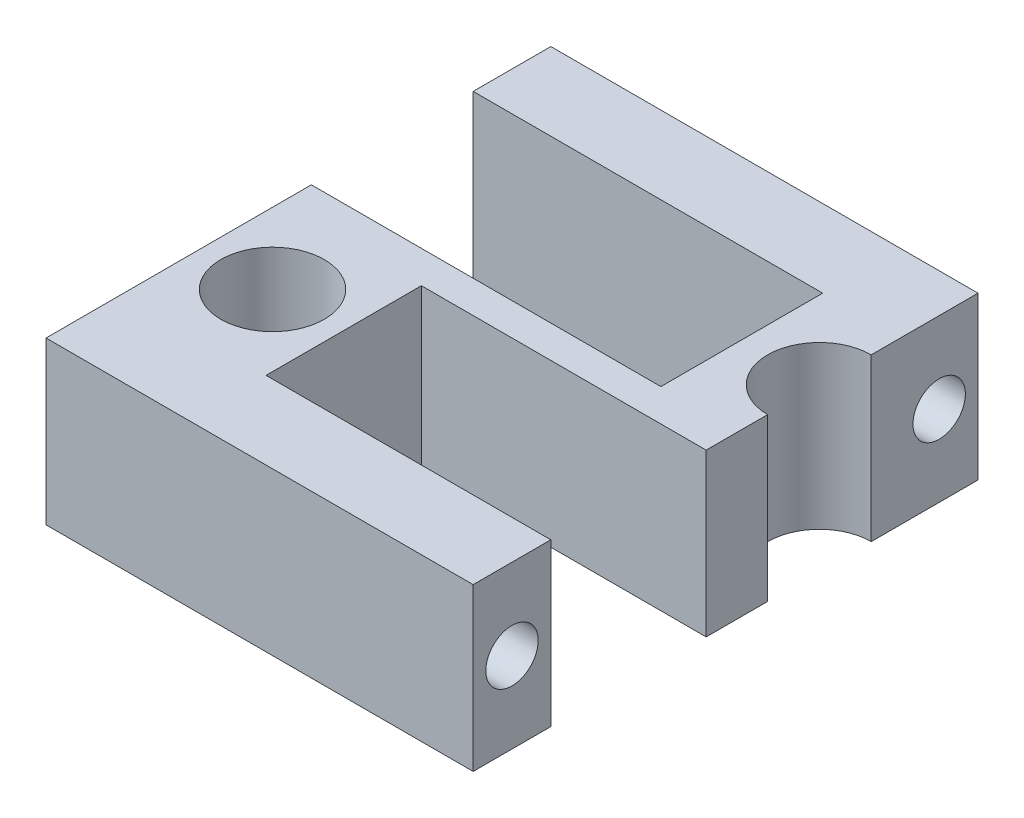
ISO-10303-21;
HEADER;
FILE_DESCRIPTION(('STEP AP214'),'2;1');
FILE_NAME('part.step','',(''),(''),'','','');
FILE_SCHEMA(('AUTOMOTIVE_DESIGN { 1 0 10303 214 1 1 1 1 }'));
ENDSEC;
DATA;
#1=APPLICATION_CONTEXT('core data for automotive mechanical design processes');
#2=APPLICATION_PROTOCOL_DEFINITION('international standard','automotive_design',2000,#1);
#3=PRODUCT_CONTEXT('',#1,'mechanical');
#4=PRODUCT('Part','Part','',(#3));
#5=PRODUCT_RELATED_PRODUCT_CATEGORY('part','',(#4));
#6=PRODUCT_DEFINITION_FORMATION('','',#4);
#7=PRODUCT_DEFINITION_CONTEXT('part definition',#1,'design');
#8=PRODUCT_DEFINITION('design','',#6,#7);
#9=PRODUCT_DEFINITION_SHAPE('','',#8);
#10=(LENGTH_UNIT() NAMED_UNIT(*) SI_UNIT(.MILLI.,.METRE.));
#11=(NAMED_UNIT(*) PLANE_ANGLE_UNIT() SI_UNIT($,.RADIAN.));
#12=(NAMED_UNIT(*) SI_UNIT($,.STERADIAN.) SOLID_ANGLE_UNIT());
#13=UNCERTAINTY_MEASURE_WITH_UNIT(LENGTH_MEASURE(1.E-05),#10,'distance_accuracy_value','');
#14=(GEOMETRIC_REPRESENTATION_CONTEXT(3) GLOBAL_UNCERTAINTY_ASSIGNED_CONTEXT((#13)) GLOBAL_UNIT_ASSIGNED_CONTEXT((#10,
#11,#12)) REPRESENTATION_CONTEXT('',''));
#15=CARTESIAN_POINT('',(0.,0.,0.));
#16=DIRECTION('',(0.,0.,1.));
#17=DIRECTION('',(1.,0.,0.));
#18=AXIS2_PLACEMENT_3D('',#15,#16,#17);
#19=CARTESIAN_POINT('',(44.,25.,-41.5));
#20=DIRECTION('',(0.,1.,0.));
#21=DIRECTION('',(0.,0.,1.));
#22=AXIS2_PLACEMENT_3D('',#19,#20,#21);
#23=PLANE('',#22);
#24=DIRECTION('',(-1.,0.,0.));
#25=VECTOR('',#24,1.);
#26=CARTESIAN_POINT('',(0.,25.,0.));
#27=LINE('',#26,#25);
#28=CARTESIAN_POINT('',(44.,25.,0.));
#29=VERTEX_POINT('',#28);
#30=CARTESIAN_POINT('',(0.,25.,0.));
#31=VERTEX_POINT('',#30);
#32=EDGE_CURVE('E195',#29,#31,#27,.T.);
#33=ORIENTED_EDGE('',*,*,#32,.T.);
#34=DIRECTION('',(0.,0.,-1.));
#35=VECTOR('',#34,1.);
#36=CARTESIAN_POINT('',(0.,25.,0.));
#37=LINE('',#36,#35);
#38=CARTESIAN_POINT('',(0.,25.,-24.));
#39=VERTEX_POINT('',#38);
#40=EDGE_CURVE('E112',#31,#39,#37,.T.);
#41=ORIENTED_EDGE('',*,*,#40,.T.);
#42=DIRECTION('',(1.,0.,0.));
#43=VECTOR('',#42,1.);
#44=CARTESIAN_POINT('',(0.,25.,-24.));
#45=LINE('',#44,#43);
#46=CARTESIAN_POINT('',(44.,25.,-24.));
#47=VERTEX_POINT('',#46);
#48=EDGE_CURVE('E229',#39,#47,#45,.T.);
#49=ORIENTED_EDGE('',*,*,#48,.T.);
#50=DIRECTION('',(0.,0.,-1.));
#51=VECTOR('',#50,1.);
#52=CARTESIAN_POINT('',(44.,25.,-24.));
#53=LINE('',#52,#51);
#54=CARTESIAN_POINT('',(44.,25.,-33.5));
#55=VERTEX_POINT('',#54);
#56=EDGE_CURVE('E247',#47,#55,#53,.T.);
#57=ORIENTED_EDGE('',*,*,#56,.T.);
#58=CARTESIAN_POINT('',(44.,25.,-41.5));
#59=DIRECTION('',(0.,-1.,0.));
#60=DIRECTION('',(0.,0.,1.));
#61=AXIS2_PLACEMENT_3D('',#58,#59,#60);
#62=CIRCLE('',#61,8.);
#63=CARTESIAN_POINT('',(44.,25.,-49.5));
#64=VERTEX_POINT('',#63);
#65=EDGE_CURVE('E244',#55,#64,#62,.T.);
#66=ORIENTED_EDGE('',*,*,#65,.T.);
#67=DIRECTION('',(0.,0.,-1.));
#68=VECTOR('',#67,1.);
#69=CARTESIAN_POINT('',(44.,25.,-49.5));
#70=LINE('',#69,#68);
#71=CARTESIAN_POINT('',(44.,25.,-66.));
#72=VERTEX_POINT('',#71);
#73=EDGE_CURVE('E246',#64,#72,#70,.T.);
#74=ORIENTED_EDGE('',*,*,#73,.T.);
#75=DIRECTION('',(-1.,0.,0.));
#76=VECTOR('',#75,1.);
#77=CARTESIAN_POINT('',(-22.,25.,-66.));
#78=LINE('',#77,#76);
#79=CARTESIAN_POINT('',(-22.,25.,-66.));
#80=VERTEX_POINT('',#79);
#81=EDGE_CURVE('E249',#72,#80,#78,.T.);
#82=ORIENTED_EDGE('',*,*,#81,.T.);
#83=DIRECTION('',(0.,0.,1.));
#84=VECTOR('',#83,1.);
#85=CARTESIAN_POINT('',(-22.,25.,-54.));
#86=LINE('',#85,#84);
#87=CARTESIAN_POINT('',(-22.,25.,-54.));
#88=VERTEX_POINT('',#87);
#89=EDGE_CURVE('E255',#80,#88,#86,.T.);
#90=ORIENTED_EDGE('',*,*,#89,.T.);
#91=DIRECTION('',(1.,0.,0.));
#92=VECTOR('',#91,1.);
#93=CARTESIAN_POINT('',(32.,25.,-54.));
#94=LINE('',#93,#92);
#95=CARTESIAN_POINT('',(32.,25.,-54.));
#96=VERTEX_POINT('',#95);
#97=EDGE_CURVE('E257',#88,#96,#94,.T.);
#98=ORIENTED_EDGE('',*,*,#97,.T.);
#99=DIRECTION('',(0.,0.,1.));
#100=VECTOR('',#99,1.);
#101=CARTESIAN_POINT('',(32.,25.,-29.));
#102=LINE('',#101,#100);
#103=CARTESIAN_POINT('',(32.,25.,-29.));
#104=VERTEX_POINT('',#103);
#105=EDGE_CURVE('E259',#96,#104,#102,.T.);
#106=ORIENTED_EDGE('',*,*,#105,.T.);
#107=DIRECTION('',(-1.,0.,0.));
#108=VECTOR('',#107,1.);
#109=CARTESIAN_POINT('',(-22.,25.,-29.));
#110=LINE('',#109,#108);
#111=CARTESIAN_POINT('',(-22.,25.,-29.));
#112=VERTEX_POINT('',#111);
#113=EDGE_CURVE('E149',#104,#112,#110,.T.);
#114=ORIENTED_EDGE('',*,*,#113,.T.);
#115=DIRECTION('',(0.,0.,1.));
#116=VECTOR('',#115,1.);
#117=CARTESIAN_POINT('',(-22.,25.,-29.));
#118=LINE('',#117,#116);
#119=CARTESIAN_POINT('',(-22.,25.,12.));
#120=VERTEX_POINT('',#119);
#121=EDGE_CURVE('E143',#112,#120,#118,.T.);
#122=ORIENTED_EDGE('',*,*,#121,.T.);
#123=DIRECTION('',(1.,0.,0.));
#124=VECTOR('',#123,1.);
#125=CARTESIAN_POINT('',(44.,25.,12.));
#126=LINE('',#125,#124);
#127=CARTESIAN_POINT('',(44.,25.,12.));
#128=VERTEX_POINT('',#127);
#129=EDGE_CURVE('E147',#120,#128,#126,.T.);
#130=ORIENTED_EDGE('',*,*,#129,.T.);
#131=DIRECTION('',(0.,0.,-1.));
#132=VECTOR('',#131,1.);
#133=CARTESIAN_POINT('',(44.,25.,0.));
#134=LINE('',#133,#132);
#135=EDGE_CURVE('E51',#128,#29,#134,.T.);
#136=ORIENTED_EDGE('',*,*,#135,.T.);
#137=EDGE_LOOP('',(#33,#41,#49,#57,#66,#74,#82,#90,#98,#106,#114,#122,#130,#136));
#138=FACE_BOUND('',#137,.T.);
#139=CARTESIAN_POINT('',(-11.,25.,-12.));
#140=DIRECTION('',(0.,1.,0.));
#141=DIRECTION('',(0.,0.,1.));
#142=AXIS2_PLACEMENT_3D('',#139,#140,#141);
#143=CIRCLE('',#142,8.);
#144=CARTESIAN_POINT('',(-11.,25.,-4.));
#145=VERTEX_POINT('',#144);
#146=EDGE_CURVE('E171',#145,#145,#143,.T.);
#147=ORIENTED_EDGE('',*,*,#146,.F.);
#148=EDGE_LOOP('',(#147));
#149=FACE_BOUND('',#148,.T.);
#150=ADVANCED_FACE('F33',(#138,#149),#23,.T.);
#151=CARTESIAN_POINT('',(44.,0.,-41.5));
#152=DIRECTION('',(0.,1.,0.));
#153=DIRECTION('',(0.,0.,1.));
#154=AXIS2_PLACEMENT_3D('',#151,#152,#153);
#155=PLANE('',#154);
#156=DIRECTION('',(-1.,0.,0.));
#157=VECTOR('',#156,1.);
#158=CARTESIAN_POINT('',(0.,0.,0.));
#159=LINE('',#158,#157);
#160=CARTESIAN_POINT('',(44.,0.,0.));
#161=VERTEX_POINT('',#160);
#162=CARTESIAN_POINT('',(0.,0.,0.));
#163=VERTEX_POINT('',#162);
#164=EDGE_CURVE('E167',#161,#163,#159,.T.);
#165=ORIENTED_EDGE('',*,*,#164,.F.);
#166=DIRECTION('',(0.,0.,-1.));
#167=VECTOR('',#166,1.);
#168=CARTESIAN_POINT('',(44.,0.,0.));
#169=LINE('',#168,#167);
#170=CARTESIAN_POINT('',(44.,0.,12.));
#171=VERTEX_POINT('',#170);
#172=EDGE_CURVE('E104',#171,#161,#169,.T.);
#173=ORIENTED_EDGE('',*,*,#172,.F.);
#174=DIRECTION('',(1.,0.,0.));
#175=VECTOR('',#174,1.);
#176=CARTESIAN_POINT('',(44.,0.,12.));
#177=LINE('',#176,#175);
#178=CARTESIAN_POINT('',(-22.,0.,12.));
#179=VERTEX_POINT('',#178);
#180=EDGE_CURVE('E98',#179,#171,#177,.T.);
#181=ORIENTED_EDGE('',*,*,#180,.F.);
#182=DIRECTION('',(0.,0.,1.));
#183=VECTOR('',#182,1.);
#184=CARTESIAN_POINT('',(-22.,0.,-29.));
#185=LINE('',#184,#183);
#186=CARTESIAN_POINT('',(-22.,0.,-29.));
#187=VERTEX_POINT('',#186);
#188=EDGE_CURVE('E157',#187,#179,#185,.T.);
#189=ORIENTED_EDGE('',*,*,#188,.F.);
#190=DIRECTION('',(-1.,0.,0.));
#191=VECTOR('',#190,1.);
#192=CARTESIAN_POINT('',(-22.,0.,-29.));
#193=LINE('',#192,#191);
#194=CARTESIAN_POINT('',(32.,0.,-29.));
#195=VERTEX_POINT('',#194);
#196=EDGE_CURVE('E190',#195,#187,#193,.T.);
#197=ORIENTED_EDGE('',*,*,#196,.F.);
#198=DIRECTION('',(0.,0.,1.));
#199=VECTOR('',#198,1.);
#200=CARTESIAN_POINT('',(32.,0.,-29.));
#201=LINE('',#200,#199);
#202=CARTESIAN_POINT('',(32.,0.,-54.));
#203=VERTEX_POINT('',#202);
#204=EDGE_CURVE('E188',#203,#195,#201,.T.);
#205=ORIENTED_EDGE('',*,*,#204,.F.);
#206=DIRECTION('',(1.,0.,0.));
#207=VECTOR('',#206,1.);
#208=CARTESIAN_POINT('',(32.,0.,-54.));
#209=LINE('',#208,#207);
#210=CARTESIAN_POINT('',(-22.,0.,-54.));
#211=VERTEX_POINT('',#210);
#212=EDGE_CURVE('E186',#211,#203,#209,.T.);
#213=ORIENTED_EDGE('',*,*,#212,.F.);
#214=DIRECTION('',(0.,0.,1.));
#215=VECTOR('',#214,1.);
#216=CARTESIAN_POINT('',(-22.,0.,-54.));
#217=LINE('',#216,#215);
#218=CARTESIAN_POINT('',(-22.,0.,-66.));
#219=VERTEX_POINT('',#218);
#220=EDGE_CURVE('E184',#219,#211,#217,.T.);
#221=ORIENTED_EDGE('',*,*,#220,.F.);
#222=DIRECTION('',(-1.,0.,0.));
#223=VECTOR('',#222,1.);
#224=CARTESIAN_POINT('',(-22.,0.,-66.));
#225=LINE('',#224,#223);
#226=CARTESIAN_POINT('',(44.,0.,-66.));
#227=VERTEX_POINT('',#226);
#228=EDGE_CURVE('E182',#227,#219,#225,.T.);
#229=ORIENTED_EDGE('',*,*,#228,.F.);
#230=DIRECTION('',(0.,0.,-1.));
#231=VECTOR('',#230,1.);
#232=CARTESIAN_POINT('',(44.,0.,-66.));
#233=LINE('',#232,#231);
#234=CARTESIAN_POINT('',(44.,0.,-49.5));
#235=VERTEX_POINT('',#234);
#236=EDGE_CURVE('E180',#235,#227,#233,.T.);
#237=ORIENTED_EDGE('',*,*,#236,.F.);
#238=CARTESIAN_POINT('',(44.,0.,-41.5));
#239=DIRECTION('',(0.,-1.,0.));
#240=DIRECTION('',(0.,0.,1.));
#241=AXIS2_PLACEMENT_3D('',#238,#239,#240);
#242=CIRCLE('',#241,8.);
#243=CARTESIAN_POINT('',(44.,0.,-33.5));
#244=VERTEX_POINT('',#243);
#245=EDGE_CURVE('E177',#244,#235,#242,.T.);
#246=ORIENTED_EDGE('',*,*,#245,.F.);
#247=DIRECTION('',(0.,0.,-1.));
#248=VECTOR('',#247,1.);
#249=CARTESIAN_POINT('',(44.,0.,-24.));
#250=LINE('',#249,#248);
#251=CARTESIAN_POINT('',(44.,0.,-24.));
#252=VERTEX_POINT('',#251);
#253=EDGE_CURVE('E175',#252,#244,#250,.T.);
#254=ORIENTED_EDGE('',*,*,#253,.F.);
#255=DIRECTION('',(1.,0.,0.));
#256=VECTOR('',#255,1.);
#257=CARTESIAN_POINT('',(0.,0.,-24.));
#258=LINE('',#257,#256);
#259=CARTESIAN_POINT('',(0.,0.,-24.));
#260=VERTEX_POINT('',#259);
#261=EDGE_CURVE('E173',#260,#252,#258,.T.);
#262=ORIENTED_EDGE('',*,*,#261,.F.);
#263=DIRECTION('',(0.,0.,-1.));
#264=VECTOR('',#263,1.);
#265=CARTESIAN_POINT('',(0.,0.,0.));
#266=LINE('',#265,#264);
#267=EDGE_CURVE('E170',#163,#260,#266,.T.);
#268=ORIENTED_EDGE('',*,*,#267,.F.);
#269=EDGE_LOOP('',(#165,#173,#181,#189,#197,#205,#213,#221,#229,#237,#246,#254,#262,#268));
#270=FACE_BOUND('',#269,.T.);
#271=CARTESIAN_POINT('',(-11.,0.,-12.));
#272=DIRECTION('',(0.,1.,0.));
#273=DIRECTION('',(0.,0.,1.));
#274=AXIS2_PLACEMENT_3D('',#271,#272,#273);
#275=CIRCLE('',#274,8.);
#276=CARTESIAN_POINT('',(-11.,0.,-4.));
#277=VERTEX_POINT('',#276);
#278=EDGE_CURVE('E317',#277,#277,#275,.T.);
#279=ORIENTED_EDGE('',*,*,#278,.T.);
#280=EDGE_LOOP('',(#279));
#281=FACE_BOUND('',#280,.T.);
#282=ADVANCED_FACE('F233',(#270,#281),#155,.F.);
#283=CARTESIAN_POINT('',(0.,25.,0.));
#284=DIRECTION('',(0.,0.,1.));
#285=DIRECTION('',(1.,0.,0.));
#286=AXIS2_PLACEMENT_3D('',#283,#284,#285);
#287=PLANE('',#286);
#288=ORIENTED_EDGE('',*,*,#164,.T.);
#289=DIRECTION('',(0.,-1.,0.));
#290=VECTOR('',#289,1.);
#291=CARTESIAN_POINT('',(0.,25.,0.));
#292=LINE('',#291,#290);
#293=EDGE_CURVE('E11',#31,#163,#292,.T.);
#294=ORIENTED_EDGE('',*,*,#293,.F.);
#295=ORIENTED_EDGE('',*,*,#32,.F.);
#296=DIRECTION('',(0.,-1.,0.));
#297=VECTOR('',#296,1.);
#298=CARTESIAN_POINT('',(44.,25.,0.));
#299=LINE('',#298,#297);
#300=EDGE_CURVE('E163',#29,#161,#299,.T.);
#301=ORIENTED_EDGE('',*,*,#300,.T.);
#302=EDGE_LOOP('',(#288,#294,#295,#301));
#303=FACE_BOUND('',#302,.T.);
#304=ADVANCED_FACE('F35',(#303),#287,.F.);
#305=CARTESIAN_POINT('',(0.,25.,0.));
#306=DIRECTION('',(-1.,0.,0.));
#307=DIRECTION('',(0.,0.,1.));
#308=AXIS2_PLACEMENT_3D('',#305,#306,#307);
#309=PLANE('',#308);
#310=ORIENTED_EDGE('',*,*,#267,.T.);
#311=DIRECTION('',(0.,-1.,0.));
#312=VECTOR('',#311,1.);
#313=CARTESIAN_POINT('',(0.,25.,-24.));
#314=LINE('',#313,#312);
#315=EDGE_CURVE('E43',#39,#260,#314,.T.);
#316=ORIENTED_EDGE('',*,*,#315,.F.);
#317=ORIENTED_EDGE('',*,*,#40,.F.);
#318=ORIENTED_EDGE('',*,*,#293,.T.);
#319=EDGE_LOOP('',(#310,#316,#317,#318));
#320=FACE_BOUND('',#319,.T.);
#321=ADVANCED_FACE('F358',(#320),#309,.F.);
#322=CARTESIAN_POINT('',(0.,25.,-24.));
#323=DIRECTION('',(0.,0.,-1.));
#324=DIRECTION('',(-1.,0.,0.));
#325=AXIS2_PLACEMENT_3D('',#322,#323,#324);
#326=PLANE('',#325);
#327=ORIENTED_EDGE('',*,*,#261,.T.);
#328=DIRECTION('',(0.,-1.,0.));
#329=VECTOR('',#328,1.);
#330=CARTESIAN_POINT('',(44.,25.,-24.));
#331=LINE('',#330,#329);
#332=EDGE_CURVE('E220',#47,#252,#331,.T.);
#333=ORIENTED_EDGE('',*,*,#332,.F.);
#334=ORIENTED_EDGE('',*,*,#48,.F.);
#335=ORIENTED_EDGE('',*,*,#315,.T.);
#336=EDGE_LOOP('',(#327,#333,#334,#335));
#337=FACE_BOUND('',#336,.T.);
#338=ADVANCED_FACE('F227',(#337),#326,.F.);
#339=CARTESIAN_POINT('',(44.,25.,-24.));
#340=DIRECTION('',(-1.,0.,0.));
#341=DIRECTION('',(0.,0.,1.));
#342=AXIS2_PLACEMENT_3D('',#339,#340,#341);
#343=PLANE('',#342);
#344=ORIENTED_EDGE('',*,*,#253,.T.);
#345=DIRECTION('',(0.,-1.,0.));
#346=VECTOR('',#345,1.);
#347=CARTESIAN_POINT('',(44.,25.,-33.5));
#348=LINE('',#347,#346);
#349=EDGE_CURVE('E217',#55,#244,#348,.T.);
#350=ORIENTED_EDGE('',*,*,#349,.F.);
#351=ORIENTED_EDGE('',*,*,#56,.F.);
#352=ORIENTED_EDGE('',*,*,#332,.T.);
#353=EDGE_LOOP('',(#344,#350,#351,#352));
#354=FACE_BOUND('',#353,.T.);
#355=ADVANCED_FACE('F238',(#354),#343,.F.);
#356=CARTESIAN_POINT('',(44.,25.,-41.5));
#357=DIRECTION('',(0.,-1.,0.));
#358=DIRECTION('',(0.,0.,-1.));
#359=AXIS2_PLACEMENT_3D('',#356,#357,#358);
#360=CYLINDRICAL_SURFACE('',#359,8.);
#361=ORIENTED_EDGE('',*,*,#245,.T.);
#362=DIRECTION('',(0.,-1.,0.));
#363=VECTOR('',#362,1.);
#364=CARTESIAN_POINT('',(44.,25.,-49.5));
#365=LINE('',#364,#363);
#366=EDGE_CURVE('E214',#64,#235,#365,.T.);
#367=ORIENTED_EDGE('',*,*,#366,.F.);
#368=ORIENTED_EDGE('',*,*,#65,.F.);
#369=ORIENTED_EDGE('',*,*,#349,.T.);
#370=EDGE_LOOP('',(#361,#367,#368,#369));
#371=FACE_BOUND('',#370,.T.);
#372=ADVANCED_FACE('F242',(#371),#360,.F.);
#373=CARTESIAN_POINT('',(44.,25.,-66.));
#374=DIRECTION('',(-1.,0.,0.));
#375=DIRECTION('',(0.,0.,1.));
#376=AXIS2_PLACEMENT_3D('',#373,#374,#375);
#377=PLANE('',#376);
#378=CARTESIAN_POINT('',(44.,12.5,-60.));
#379=DIRECTION('',(1.,0.,0.));
#380=DIRECTION('',(0.,0.,-1.));
#381=AXIS2_PLACEMENT_3D('',#378,#379,#380);
#382=CIRCLE('',#381,4.05000000000001);
#383=CARTESIAN_POINT('',(44.,12.5,-64.05));
#384=VERTEX_POINT('',#383);
#385=EDGE_CURVE('E305',#384,#384,#382,.T.);
#386=ORIENTED_EDGE('',*,*,#385,.F.);
#387=EDGE_LOOP('',(#386));
#388=FACE_BOUND('',#387,.T.);
#389=ORIENTED_EDGE('',*,*,#236,.T.);
#390=DIRECTION('',(0.,-1.,0.));
#391=VECTOR('',#390,1.);
#392=CARTESIAN_POINT('',(44.,25.,-66.));
#393=LINE('',#392,#391);
#394=EDGE_CURVE('E211',#72,#227,#393,.T.);
#395=ORIENTED_EDGE('',*,*,#394,.F.);
#396=ORIENTED_EDGE('',*,*,#73,.F.);
#397=ORIENTED_EDGE('',*,*,#366,.T.);
#398=EDGE_LOOP('',(#389,#395,#396,#397));
#399=FACE_BOUND('',#398,.T.);
#400=ADVANCED_FACE('F348',(#388,#399),#377,.F.);
#401=CARTESIAN_POINT('',(-22.,25.,-66.));
#402=DIRECTION('',(0.,0.,1.));
#403=DIRECTION('',(1.,0.,0.));
#404=AXIS2_PLACEMENT_3D('',#401,#402,#403);
#405=PLANE('',#404);
#406=ORIENTED_EDGE('',*,*,#228,.T.);
#407=DIRECTION('',(0.,-1.,0.));
#408=VECTOR('',#407,1.);
#409=CARTESIAN_POINT('',(-22.,25.,-66.));
#410=LINE('',#409,#408);
#411=EDGE_CURVE('E208',#80,#219,#410,.T.);
#412=ORIENTED_EDGE('',*,*,#411,.F.);
#413=ORIENTED_EDGE('',*,*,#81,.F.);
#414=ORIENTED_EDGE('',*,*,#394,.T.);
#415=EDGE_LOOP('',(#406,#412,#413,#414));
#416=FACE_BOUND('',#415,.T.);
#417=ADVANCED_FACE('F345',(#416),#405,.F.);
#418=CARTESIAN_POINT('',(-22.,25.,-54.));
#419=DIRECTION('',(1.,0.,0.));
#420=DIRECTION('',(0.,0.,-1.));
#421=AXIS2_PLACEMENT_3D('',#418,#419,#420);
#422=PLANE('',#421);
#423=CARTESIAN_POINT('',(-22.,12.5,-60.));
#424=DIRECTION('',(1.,0.,0.));
#425=DIRECTION('',(0.,0.,-1.));
#426=AXIS2_PLACEMENT_3D('',#423,#424,#425);
#427=CIRCLE('',#426,4.05000000000001);
#428=CARTESIAN_POINT('',(-22.,12.5,-64.05));
#429=VERTEX_POINT('',#428);
#430=EDGE_CURVE('E37',#429,#429,#427,.T.);
#431=ORIENTED_EDGE('',*,*,#430,.T.);
#432=EDGE_LOOP('',(#431));
#433=FACE_BOUND('',#432,.T.);
#434=ORIENTED_EDGE('',*,*,#220,.T.);
#435=DIRECTION('',(0.,-1.,0.));
#436=VECTOR('',#435,1.);
#437=CARTESIAN_POINT('',(-22.,25.,-54.));
#438=LINE('',#437,#436);
#439=EDGE_CURVE('E205',#88,#211,#438,.T.);
#440=ORIENTED_EDGE('',*,*,#439,.F.);
#441=ORIENTED_EDGE('',*,*,#89,.F.);
#442=ORIENTED_EDGE('',*,*,#411,.T.);
#443=EDGE_LOOP('',(#434,#440,#441,#442));
#444=FACE_BOUND('',#443,.T.);
#445=ADVANCED_FACE('F341',(#433,#444),#422,.F.);
#446=CARTESIAN_POINT('',(32.,25.,-54.));
#447=DIRECTION('',(0.,0.,-1.));
#448=DIRECTION('',(-1.,0.,0.));
#449=AXIS2_PLACEMENT_3D('',#446,#447,#448);
#450=PLANE('',#449);
#451=ORIENTED_EDGE('',*,*,#212,.T.);
#452=DIRECTION('',(0.,-1.,0.));
#453=VECTOR('',#452,1.);
#454=CARTESIAN_POINT('',(32.,25.,-54.));
#455=LINE('',#454,#453);
#456=EDGE_CURVE('E202',#96,#203,#455,.T.);
#457=ORIENTED_EDGE('',*,*,#456,.F.);
#458=ORIENTED_EDGE('',*,*,#97,.F.);
#459=ORIENTED_EDGE('',*,*,#439,.T.);
#460=EDGE_LOOP('',(#451,#457,#458,#459));
#461=FACE_BOUND('',#460,.T.);
#462=ADVANCED_FACE('F338',(#461),#450,.F.);
#463=CARTESIAN_POINT('',(32.,25.,-29.));
#464=DIRECTION('',(1.,0.,0.));
#465=DIRECTION('',(0.,0.,-1.));
#466=AXIS2_PLACEMENT_3D('',#463,#464,#465);
#467=PLANE('',#466);
#468=ORIENTED_EDGE('',*,*,#204,.T.);
#469=DIRECTION('',(0.,-1.,0.));
#470=VECTOR('',#469,1.);
#471=CARTESIAN_POINT('',(32.,25.,-29.));
#472=LINE('',#471,#470);
#473=EDGE_CURVE('E199',#104,#195,#472,.T.);
#474=ORIENTED_EDGE('',*,*,#473,.F.);
#475=ORIENTED_EDGE('',*,*,#105,.F.);
#476=ORIENTED_EDGE('',*,*,#456,.T.);
#477=EDGE_LOOP('',(#468,#474,#475,#476));
#478=FACE_BOUND('',#477,.T.);
#479=ADVANCED_FACE('F265',(#478),#467,.F.);
#480=CARTESIAN_POINT('',(-22.,25.,-29.));
#481=DIRECTION('',(0.,0.,1.));
#482=DIRECTION('',(1.,0.,0.));
#483=AXIS2_PLACEMENT_3D('',#480,#481,#482);
#484=PLANE('',#483);
#485=ORIENTED_EDGE('',*,*,#196,.T.);
#486=DIRECTION('',(0.,-1.,0.));
#487=VECTOR('',#486,1.);
#488=CARTESIAN_POINT('',(-22.,25.,-29.));
#489=LINE('',#488,#487);
#490=EDGE_CURVE('E158',#112,#187,#489,.T.);
#491=ORIENTED_EDGE('',*,*,#490,.F.);
#492=ORIENTED_EDGE('',*,*,#113,.F.);
#493=ORIENTED_EDGE('',*,*,#473,.T.);
#494=EDGE_LOOP('',(#485,#491,#492,#493));
#495=FACE_BOUND('',#494,.T.);
#496=ADVANCED_FACE('F269',(#495),#484,.F.);
#497=CARTESIAN_POINT('',(-22.,25.,-29.));
#498=DIRECTION('',(1.,0.,0.));
#499=DIRECTION('',(0.,0.,-1.));
#500=AXIS2_PLACEMENT_3D('',#497,#498,#499);
#501=PLANE('',#500);
#502=CARTESIAN_POINT('',(-22.,12.5,6.));
#503=DIRECTION('',(1.,0.,0.));
#504=DIRECTION('',(0.,0.,-1.));
#505=AXIS2_PLACEMENT_3D('',#502,#503,#504);
#506=CIRCLE('',#505,4.05);
#507=CARTESIAN_POINT('',(-22.,12.5,1.95));
#508=VERTEX_POINT('',#507);
#509=EDGE_CURVE('E311',#508,#508,#506,.T.);
#510=ORIENTED_EDGE('',*,*,#509,.T.);
#511=EDGE_LOOP('',(#510));
#512=FACE_BOUND('',#511,.T.);
#513=ORIENTED_EDGE('',*,*,#188,.T.);
#514=DIRECTION('',(0.,-1.,0.));
#515=VECTOR('',#514,1.);
#516=CARTESIAN_POINT('',(-22.,25.,12.));
#517=LINE('',#516,#515);
#518=EDGE_CURVE('E154',#120,#179,#517,.T.);
#519=ORIENTED_EDGE('',*,*,#518,.F.);
#520=ORIENTED_EDGE('',*,*,#121,.F.);
#521=ORIENTED_EDGE('',*,*,#490,.T.);
#522=EDGE_LOOP('',(#513,#519,#520,#521));
#523=FACE_BOUND('',#522,.T.);
#524=ADVANCED_FACE('F155',(#512,#523),#501,.F.);
#525=CARTESIAN_POINT('',(44.,25.,12.));
#526=DIRECTION('',(0.,0.,-1.));
#527=DIRECTION('',(-1.,0.,0.));
#528=AXIS2_PLACEMENT_3D('',#525,#526,#527);
#529=PLANE('',#528);
#530=ORIENTED_EDGE('',*,*,#180,.T.);
#531=DIRECTION('',(0.,-1.,0.));
#532=VECTOR('',#531,1.);
#533=CARTESIAN_POINT('',(44.,25.,12.));
#534=LINE('',#533,#532);
#535=EDGE_CURVE('E159',#128,#171,#534,.T.);
#536=ORIENTED_EDGE('',*,*,#535,.F.);
#537=ORIENTED_EDGE('',*,*,#129,.F.);
#538=ORIENTED_EDGE('',*,*,#518,.T.);
#539=EDGE_LOOP('',(#530,#536,#537,#538));
#540=FACE_BOUND('',#539,.T.);
#541=ADVANCED_FACE('F161',(#540),#529,.F.);
#542=CARTESIAN_POINT('',(44.,25.,0.));
#543=DIRECTION('',(-1.,0.,0.));
#544=DIRECTION('',(0.,0.,1.));
#545=AXIS2_PLACEMENT_3D('',#542,#543,#544);
#546=PLANE('',#545);
#547=CARTESIAN_POINT('',(44.,12.5,6.));
#548=DIRECTION('',(1.,0.,0.));
#549=DIRECTION('',(0.,0.,-1.));
#550=AXIS2_PLACEMENT_3D('',#547,#548,#549);
#551=CIRCLE('',#550,4.05);
#552=CARTESIAN_POINT('',(44.,12.5,1.95));
#553=VERTEX_POINT('',#552);
#554=EDGE_CURVE('E309',#553,#553,#551,.T.);
#555=ORIENTED_EDGE('',*,*,#554,.F.);
#556=EDGE_LOOP('',(#555));
#557=FACE_BOUND('',#556,.T.);
#558=ORIENTED_EDGE('',*,*,#172,.T.);
#559=ORIENTED_EDGE('',*,*,#300,.F.);
#560=ORIENTED_EDGE('',*,*,#135,.F.);
#561=ORIENTED_EDGE('',*,*,#535,.T.);
#562=EDGE_LOOP('',(#558,#559,#560,#561));
#563=FACE_BOUND('',#562,.T.);
#564=ADVANCED_FACE('F273',(#557,#563),#546,.F.);
#565=CARTESIAN_POINT('',(-11.,25.,-12.));
#566=DIRECTION('',(0.,-1.,0.));
#567=DIRECTION('',(0.,0.,-1.));
#568=AXIS2_PLACEMENT_3D('',#565,#566,#567);
#569=CYLINDRICAL_SURFACE('',#568,8.);
#570=ORIENTED_EDGE('',*,*,#146,.T.);
#571=EDGE_LOOP('',(#570));
#572=FACE_BOUND('',#571,.T.);
#573=ORIENTED_EDGE('',*,*,#278,.F.);
#574=EDGE_LOOP('',(#573));
#575=FACE_BOUND('',#574,.T.);
#576=ADVANCED_FACE('F275',(#572,#575),#569,.F.);
#577=CARTESIAN_POINT('',(-32.,12.5,6.));
#578=DIRECTION('',(1.,0.,0.));
#579=DIRECTION('',(0.,0.,-1.));
#580=AXIS2_PLACEMENT_3D('',#577,#578,#579);
#581=CYLINDRICAL_SURFACE('',#580,4.05);
#582=ORIENTED_EDGE('',*,*,#554,.T.);
#583=EDGE_LOOP('',(#582));
#584=FACE_BOUND('',#583,.T.);
#585=ORIENTED_EDGE('',*,*,#509,.F.);
#586=EDGE_LOOP('',(#585));
#587=FACE_BOUND('',#586,.T.);
#588=ADVANCED_FACE('F282',(#584,#587),#581,.F.);
#589=CARTESIAN_POINT('',(-32.,12.5,-60.));
#590=DIRECTION('',(1.,0.,0.));
#591=DIRECTION('',(0.,0.,-1.));
#592=AXIS2_PLACEMENT_3D('',#589,#590,#591);
#593=CYLINDRICAL_SURFACE('',#592,4.05000000000001);
#594=ORIENTED_EDGE('',*,*,#385,.T.);
#595=EDGE_LOOP('',(#594));
#596=FACE_BOUND('',#595,.T.);
#597=ORIENTED_EDGE('',*,*,#430,.F.);
#598=EDGE_LOOP('',(#597));
#599=FACE_BOUND('',#598,.T.);
#600=ADVANCED_FACE('F296',(#596,#599),#593,.F.);
#601=CLOSED_SHELL('',(#150,#282,#304,#321,#338,#355,#372,#400,#417,#445,#462,#479,#496,#524,
#541,#564,#576,#588,#600));
#602=MANIFOLD_SOLID_BREP('B2',#601);
#603=ADVANCED_BREP_SHAPE_REPRESENTATION('',(#18,#602),#14);
#604=SHAPE_DEFINITION_REPRESENTATION(#9,#603);
ENDSEC;
END-ISO-10303-21;
